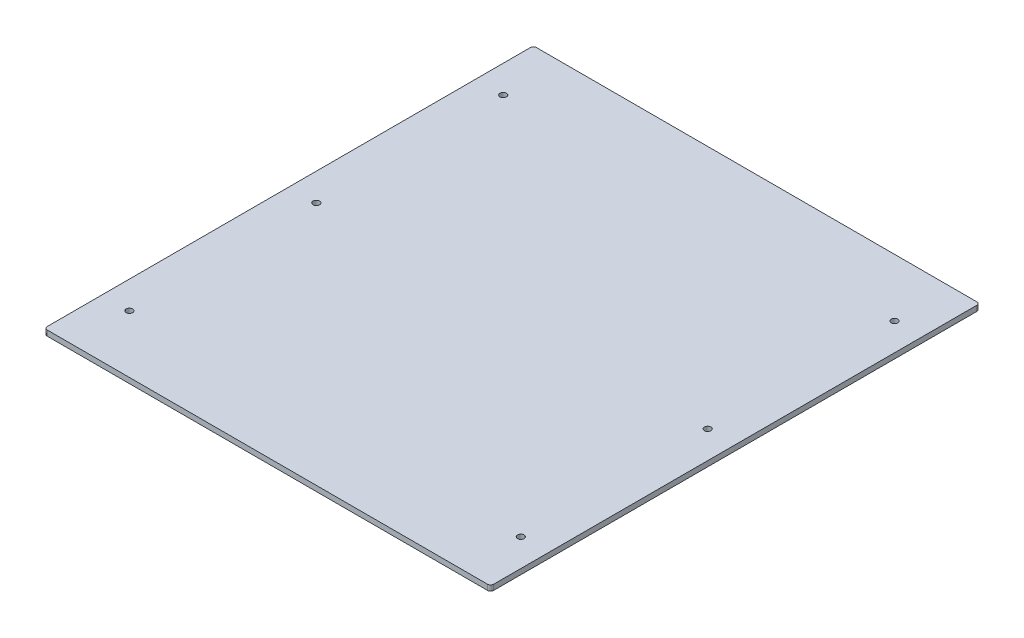
ISO-10303-21;
HEADER;
FILE_DESCRIPTION(('STEP AP214'),'2;1');
FILE_NAME('part.step','',(''),(''),'','','');
FILE_SCHEMA(('AUTOMOTIVE_DESIGN { 1 0 10303 214 1 1 1 1 }'));
ENDSEC;
DATA;
#1=APPLICATION_CONTEXT('core data for automotive mechanical design processes');
#2=APPLICATION_PROTOCOL_DEFINITION('international standard','automotive_design',2000,#1);
#3=PRODUCT_CONTEXT('',#1,'mechanical');
#4=PRODUCT('Part','Part','',(#3));
#5=PRODUCT_RELATED_PRODUCT_CATEGORY('part','',(#4));
#6=PRODUCT_DEFINITION_FORMATION('','',#4);
#7=PRODUCT_DEFINITION_CONTEXT('part definition',#1,'design');
#8=PRODUCT_DEFINITION('design','',#6,#7);
#9=PRODUCT_DEFINITION_SHAPE('','',#8);
#10=(LENGTH_UNIT() NAMED_UNIT(*) SI_UNIT(.MILLI.,.METRE.));
#11=(NAMED_UNIT(*) PLANE_ANGLE_UNIT() SI_UNIT($,.RADIAN.));
#12=(NAMED_UNIT(*) SI_UNIT($,.STERADIAN.) SOLID_ANGLE_UNIT());
#13=UNCERTAINTY_MEASURE_WITH_UNIT(LENGTH_MEASURE(1.E-05),#10,'distance_accuracy_value','');
#14=(GEOMETRIC_REPRESENTATION_CONTEXT(3) GLOBAL_UNCERTAINTY_ASSIGNED_CONTEXT((#13)) GLOBAL_UNIT_ASSIGNED_CONTEXT((#10,
#11,#12)) REPRESENTATION_CONTEXT('',''));
#15=CARTESIAN_POINT('',(0.,0.,0.));
#16=DIRECTION('',(0.,0.,1.));
#17=DIRECTION('',(1.,0.,0.));
#18=AXIS2_PLACEMENT_3D('',#15,#16,#17);
#19=CARTESIAN_POINT('',(0.,5.588,0.));
#20=DIRECTION('',(0.,-1.,0.));
#21=DIRECTION('',(0.,0.,-1.));
#22=AXIS2_PLACEMENT_3D('',#19,#20,#21);
#23=PLANE('',#22);
#24=DIRECTION('',(-1.,0.,0.));
#25=VECTOR('',#24,1.);
#26=CARTESIAN_POINT('',(0.,5.588,-508.));
#27=LINE('',#26,#25);
#28=CARTESIAN_POINT('',(460.375,5.588,-508.));
#29=VERTEX_POINT('',#28);
#30=CARTESIAN_POINT('',(3.175,5.588,-508.));
#31=VERTEX_POINT('',#30);
#32=EDGE_CURVE('E148',#29,#31,#27,.T.);
#33=ORIENTED_EDGE('',*,*,#32,.T.);
#34=CARTESIAN_POINT('',(3.175,5.588,-504.825));
#35=DIRECTION('',(0.,-1.,0.));
#36=DIRECTION('',(0.,0.,-1.));
#37=AXIS2_PLACEMENT_3D('',#34,#35,#36);
#38=CIRCLE('',#37,3.175);
#39=CARTESIAN_POINT('',(0.,5.588,-504.825));
#40=VERTEX_POINT('',#39);
#41=EDGE_CURVE('E177',#31,#40,#38,.F.);
#42=ORIENTED_EDGE('',*,*,#41,.T.);
#43=DIRECTION('',(0.,0.,1.));
#44=VECTOR('',#43,1.);
#45=CARTESIAN_POINT('',(0.,5.588,0.));
#46=LINE('',#45,#44);
#47=CARTESIAN_POINT('',(0.,5.588,-3.175));
#48=VERTEX_POINT('',#47);
#49=EDGE_CURVE('E125',#40,#48,#46,.T.);
#50=ORIENTED_EDGE('',*,*,#49,.T.);
#51=CARTESIAN_POINT('',(3.175,5.588,-3.175));
#52=DIRECTION('',(0.,-1.,0.));
#53=DIRECTION('',(0.,0.,-1.));
#54=AXIS2_PLACEMENT_3D('',#51,#52,#53);
#55=CIRCLE('',#54,3.175);
#56=CARTESIAN_POINT('',(3.175,5.588,0.));
#57=VERTEX_POINT('',#56);
#58=EDGE_CURVE('E171',#48,#57,#55,.F.);
#59=ORIENTED_EDGE('',*,*,#58,.T.);
#60=DIRECTION('',(1.,0.,0.));
#61=VECTOR('',#60,1.);
#62=CARTESIAN_POINT('',(0.,5.588,0.));
#63=LINE('',#62,#61);
#64=CARTESIAN_POINT('',(460.375,5.588,0.));
#65=VERTEX_POINT('',#64);
#66=EDGE_CURVE('E191',#57,#65,#63,.T.);
#67=ORIENTED_EDGE('',*,*,#66,.T.);
#68=CARTESIAN_POINT('',(460.375,5.588,-3.175));
#69=DIRECTION('',(0.,-1.,0.));
#70=DIRECTION('',(0.,0.,-1.));
#71=AXIS2_PLACEMENT_3D('',#68,#69,#70);
#72=CIRCLE('',#71,3.175);
#73=CARTESIAN_POINT('',(463.55,5.588,-3.175));
#74=VERTEX_POINT('',#73);
#75=EDGE_CURVE('E59',#65,#74,#72,.F.);
#76=ORIENTED_EDGE('',*,*,#75,.T.);
#77=DIRECTION('',(0.,0.,-1.));
#78=VECTOR('',#77,1.);
#79=CARTESIAN_POINT('',(463.55,5.588,0.));
#80=LINE('',#79,#78);
#81=CARTESIAN_POINT('',(463.55,5.588,-504.825));
#82=VERTEX_POINT('',#81);
#83=EDGE_CURVE('E198',#74,#82,#80,.T.);
#84=ORIENTED_EDGE('',*,*,#83,.T.);
#85=CARTESIAN_POINT('',(460.375,5.588,-504.825));
#86=DIRECTION('',(0.,-1.,0.));
#87=DIRECTION('',(0.,0.,-1.));
#88=AXIS2_PLACEMENT_3D('',#85,#86,#87);
#89=CIRCLE('',#88,3.175);
#90=EDGE_CURVE('E174',#82,#29,#89,.F.);
#91=ORIENTED_EDGE('',*,*,#90,.T.);
#92=EDGE_LOOP('',(#33,#42,#50,#59,#67,#76,#84,#91));
#93=FACE_BOUND('',#92,.T.);
#94=CARTESIAN_POINT('',(28.575,5.588,-59.944));
#95=DIRECTION('',(0.,1.,0.));
#96=DIRECTION('',(0.,0.,1.));
#97=AXIS2_PLACEMENT_3D('',#94,#95,#96);
#98=CIRCLE('',#97,3.37820000000002);
#99=CARTESIAN_POINT('',(28.575,5.588,-56.5658));
#100=VERTEX_POINT('',#99);
#101=EDGE_CURVE('E136',#100,#100,#98,.T.);
#102=ORIENTED_EDGE('',*,*,#101,.F.);
#103=EDGE_LOOP('',(#102));
#104=FACE_BOUND('',#103,.T.);
#105=CARTESIAN_POINT('',(28.575,5.588,-254.));
#106=DIRECTION('',(0.,1.,0.));
#107=DIRECTION('',(0.,0.,1.));
#108=AXIS2_PLACEMENT_3D('',#105,#106,#107);
#109=CIRCLE('',#108,3.37819999999999);
#110=CARTESIAN_POINT('',(28.575,5.588,-250.6218));
#111=VERTEX_POINT('',#110);
#112=EDGE_CURVE('E219',#111,#111,#109,.T.);
#113=ORIENTED_EDGE('',*,*,#112,.F.);
#114=EDGE_LOOP('',(#113));
#115=FACE_BOUND('',#114,.T.);
#116=CARTESIAN_POINT('',(28.575,5.588,-448.056));
#117=DIRECTION('',(0.,1.,0.));
#118=DIRECTION('',(0.,0.,1.));
#119=AXIS2_PLACEMENT_3D('',#116,#117,#118);
#120=CIRCLE('',#119,3.37819999999999);
#121=CARTESIAN_POINT('',(28.575,5.588,-444.6778));
#122=VERTEX_POINT('',#121);
#123=EDGE_CURVE('E225',#122,#122,#120,.T.);
#124=ORIENTED_EDGE('',*,*,#123,.F.);
#125=EDGE_LOOP('',(#124));
#126=FACE_BOUND('',#125,.T.);
#127=CARTESIAN_POINT('',(434.975,5.588,-448.056));
#128=DIRECTION('',(0.,1.,0.));
#129=DIRECTION('',(0.,0.,-1.));
#130=AXIS2_PLACEMENT_3D('',#127,#128,#129);
#131=CIRCLE('',#130,3.37819999999999);
#132=CARTESIAN_POINT('',(434.975,5.588,-451.4342));
#133=VERTEX_POINT('',#132);
#134=EDGE_CURVE('E233',#133,#133,#131,.T.);
#135=ORIENTED_EDGE('',*,*,#134,.F.);
#136=EDGE_LOOP('',(#135));
#137=FACE_BOUND('',#136,.T.);
#138=CARTESIAN_POINT('',(434.975,5.588,-254.));
#139=DIRECTION('',(0.,1.,0.));
#140=DIRECTION('',(0.,0.,-1.));
#141=AXIS2_PLACEMENT_3D('',#138,#139,#140);
#142=CIRCLE('',#141,3.37819999999999);
#143=CARTESIAN_POINT('',(434.975,5.588,-257.3782));
#144=VERTEX_POINT('',#143);
#145=EDGE_CURVE('E241',#144,#144,#142,.T.);
#146=ORIENTED_EDGE('',*,*,#145,.F.);
#147=EDGE_LOOP('',(#146));
#148=FACE_BOUND('',#147,.T.);
#149=CARTESIAN_POINT('',(434.975,5.588,-59.944));
#150=DIRECTION('',(0.,1.,0.));
#151=DIRECTION('',(0.,0.,-1.));
#152=AXIS2_PLACEMENT_3D('',#149,#150,#151);
#153=CIRCLE('',#152,3.37819999999999);
#154=CARTESIAN_POINT('',(434.975,5.588,-63.3222));
#155=VERTEX_POINT('',#154);
#156=EDGE_CURVE('E249',#155,#155,#153,.T.);
#157=ORIENTED_EDGE('',*,*,#156,.F.);
#158=EDGE_LOOP('',(#157));
#159=FACE_BOUND('',#158,.T.);
#160=ADVANCED_FACE('F36',(#93,#104,#115,#126,#137,#148,#159),#23,.F.);
#161=CARTESIAN_POINT('',(0.,0.,0.));
#162=DIRECTION('',(0.,-1.,0.));
#163=DIRECTION('',(0.,0.,-1.));
#164=AXIS2_PLACEMENT_3D('',#161,#162,#163);
#165=PLANE('',#164);
#166=CARTESIAN_POINT('',(434.975,0.,-254.));
#167=DIRECTION('',(0.,1.,0.));
#168=DIRECTION('',(0.,0.,-1.));
#169=AXIS2_PLACEMENT_3D('',#166,#167,#168);
#170=CIRCLE('',#169,3.37819999999999);
#171=CARTESIAN_POINT('',(434.975,0.,-257.3782));
#172=VERTEX_POINT('',#171);
#173=EDGE_CURVE('E245',#172,#172,#170,.T.);
#174=ORIENTED_EDGE('',*,*,#173,.T.);
#175=EDGE_LOOP('',(#174));
#176=FACE_BOUND('',#175,.T.);
#177=CARTESIAN_POINT('',(28.575,0.,-448.056));
#178=DIRECTION('',(0.,1.,0.));
#179=DIRECTION('',(0.,0.,1.));
#180=AXIS2_PLACEMENT_3D('',#177,#178,#179);
#181=CIRCLE('',#180,3.37819999999999);
#182=CARTESIAN_POINT('',(28.575,0.,-444.6778));
#183=VERTEX_POINT('',#182);
#184=EDGE_CURVE('E229',#183,#183,#181,.T.);
#185=ORIENTED_EDGE('',*,*,#184,.T.);
#186=EDGE_LOOP('',(#185));
#187=FACE_BOUND('',#186,.T.);
#188=CARTESIAN_POINT('',(28.575,0.,-59.944));
#189=DIRECTION('',(0.,1.,0.));
#190=DIRECTION('',(0.,0.,1.));
#191=AXIS2_PLACEMENT_3D('',#188,#189,#190);
#192=CIRCLE('',#191,3.37820000000002);
#193=CARTESIAN_POINT('',(28.575,0.,-56.5658));
#194=VERTEX_POINT('',#193);
#195=EDGE_CURVE('E145',#194,#194,#192,.T.);
#196=ORIENTED_EDGE('',*,*,#195,.T.);
#197=EDGE_LOOP('',(#196));
#198=FACE_BOUND('',#197,.T.);
#199=DIRECTION('',(0.,0.,1.));
#200=VECTOR('',#199,1.);
#201=CARTESIAN_POINT('',(0.,0.,0.));
#202=LINE('',#201,#200);
#203=CARTESIAN_POINT('',(0.,0.,-504.825));
#204=VERTEX_POINT('',#203);
#205=CARTESIAN_POINT('',(0.,0.,-3.175));
#206=VERTEX_POINT('',#205);
#207=EDGE_CURVE('E122',#204,#206,#202,.T.);
#208=ORIENTED_EDGE('',*,*,#207,.F.);
#209=CARTESIAN_POINT('',(3.175,0.,-504.825));
#210=DIRECTION('',(0.,-1.,0.));
#211=DIRECTION('',(0.,0.,-1.));
#212=AXIS2_PLACEMENT_3D('',#209,#210,#211);
#213=CIRCLE('',#212,3.175);
#214=CARTESIAN_POINT('',(3.175,0.,-508.));
#215=VERTEX_POINT('',#214);
#216=EDGE_CURVE('E104',#204,#215,#213,.T.);
#217=ORIENTED_EDGE('',*,*,#216,.T.);
#218=DIRECTION('',(-1.,0.,0.));
#219=VECTOR('',#218,1.);
#220=CARTESIAN_POINT('',(0.,0.,-508.));
#221=LINE('',#220,#219);
#222=CARTESIAN_POINT('',(460.375,0.,-508.));
#223=VERTEX_POINT('',#222);
#224=EDGE_CURVE('E153',#223,#215,#221,.T.);
#225=ORIENTED_EDGE('',*,*,#224,.F.);
#226=CARTESIAN_POINT('',(460.375,0.,-504.825));
#227=DIRECTION('',(0.,-1.,0.));
#228=DIRECTION('',(0.,0.,-1.));
#229=AXIS2_PLACEMENT_3D('',#226,#227,#228);
#230=CIRCLE('',#229,3.175);
#231=CARTESIAN_POINT('',(463.55,0.,-504.825));
#232=VERTEX_POINT('',#231);
#233=EDGE_CURVE('E116',#223,#232,#230,.T.);
#234=ORIENTED_EDGE('',*,*,#233,.T.);
#235=DIRECTION('',(0.,0.,-1.));
#236=VECTOR('',#235,1.);
#237=CARTESIAN_POINT('',(463.55,0.,0.));
#238=LINE('',#237,#236);
#239=CARTESIAN_POINT('',(463.55,0.,-3.175));
#240=VERTEX_POINT('',#239);
#241=EDGE_CURVE('E142',#240,#232,#238,.T.);
#242=ORIENTED_EDGE('',*,*,#241,.F.);
#243=CARTESIAN_POINT('',(460.375,0.,-3.175));
#244=DIRECTION('',(0.,-1.,0.));
#245=DIRECTION('',(0.,0.,-1.));
#246=AXIS2_PLACEMENT_3D('',#243,#244,#245);
#247=CIRCLE('',#246,3.175);
#248=CARTESIAN_POINT('',(460.375,0.,0.));
#249=VERTEX_POINT('',#248);
#250=EDGE_CURVE('E127',#240,#249,#247,.T.);
#251=ORIENTED_EDGE('',*,*,#250,.T.);
#252=DIRECTION('',(1.,0.,0.));
#253=VECTOR('',#252,1.);
#254=CARTESIAN_POINT('',(0.,0.,0.));
#255=LINE('',#254,#253);
#256=CARTESIAN_POINT('',(3.175,0.,0.));
#257=VERTEX_POINT('',#256);
#258=EDGE_CURVE('E135',#257,#249,#255,.T.);
#259=ORIENTED_EDGE('',*,*,#258,.F.);
#260=CARTESIAN_POINT('',(3.175,0.,-3.175));
#261=DIRECTION('',(0.,-1.,0.));
#262=DIRECTION('',(0.,0.,-1.));
#263=AXIS2_PLACEMENT_3D('',#260,#261,#262);
#264=CIRCLE('',#263,3.175);
#265=EDGE_CURVE('E133',#257,#206,#264,.T.);
#266=ORIENTED_EDGE('',*,*,#265,.T.);
#267=EDGE_LOOP('',(#208,#217,#225,#234,#242,#251,#259,#266));
#268=FACE_BOUND('',#267,.T.);
#269=CARTESIAN_POINT('',(28.575,0.,-254.));
#270=DIRECTION('',(0.,1.,0.));
#271=DIRECTION('',(0.,0.,1.));
#272=AXIS2_PLACEMENT_3D('',#269,#270,#271);
#273=CIRCLE('',#272,3.37819999999999);
#274=CARTESIAN_POINT('',(28.575,0.,-250.6218));
#275=VERTEX_POINT('',#274);
#276=EDGE_CURVE('E221',#275,#275,#273,.T.);
#277=ORIENTED_EDGE('',*,*,#276,.T.);
#278=EDGE_LOOP('',(#277));
#279=FACE_BOUND('',#278,.T.);
#280=CARTESIAN_POINT('',(434.975,0.,-448.056));
#281=DIRECTION('',(0.,1.,0.));
#282=DIRECTION('',(0.,0.,-1.));
#283=AXIS2_PLACEMENT_3D('',#280,#281,#282);
#284=CIRCLE('',#283,3.37819999999999);
#285=CARTESIAN_POINT('',(434.975,0.,-451.4342));
#286=VERTEX_POINT('',#285);
#287=EDGE_CURVE('E237',#286,#286,#284,.T.);
#288=ORIENTED_EDGE('',*,*,#287,.T.);
#289=EDGE_LOOP('',(#288));
#290=FACE_BOUND('',#289,.T.);
#291=CARTESIAN_POINT('',(434.975,0.,-59.944));
#292=DIRECTION('',(0.,1.,0.));
#293=DIRECTION('',(0.,0.,-1.));
#294=AXIS2_PLACEMENT_3D('',#291,#292,#293);
#295=CIRCLE('',#294,3.37819999999999);
#296=CARTESIAN_POINT('',(434.975,0.,-63.3222));
#297=VERTEX_POINT('',#296);
#298=EDGE_CURVE('E253',#297,#297,#295,.T.);
#299=ORIENTED_EDGE('',*,*,#298,.T.);
#300=EDGE_LOOP('',(#299));
#301=FACE_BOUND('',#300,.T.);
#302=ADVANCED_FACE('F130',(#176,#187,#198,#268,#279,#290,#301),#165,.T.);
#303=CARTESIAN_POINT('',(0.,5.588,0.));
#304=DIRECTION('',(1.,0.,0.));
#305=DIRECTION('',(0.,0.,-1.));
#306=AXIS2_PLACEMENT_3D('',#303,#304,#305);
#307=PLANE('',#306);
#308=ORIENTED_EDGE('',*,*,#49,.F.);
#309=DIRECTION('',(0.,-1.,0.));
#310=VECTOR('',#309,1.);
#311=CARTESIAN_POINT('',(0.,5.588,-504.825));
#312=LINE('',#311,#310);
#313=EDGE_CURVE('E108',#40,#204,#312,.T.);
#314=ORIENTED_EDGE('',*,*,#313,.T.);
#315=ORIENTED_EDGE('',*,*,#207,.T.);
#316=DIRECTION('',(0.,-1.,0.));
#317=VECTOR('',#316,1.);
#318=CARTESIAN_POINT('',(0.,5.588,-3.175));
#319=LINE('',#318,#317);
#320=EDGE_CURVE('E128',#206,#48,#319,.F.);
#321=ORIENTED_EDGE('',*,*,#320,.T.);
#322=EDGE_LOOP('',(#308,#314,#315,#321));
#323=FACE_BOUND('',#322,.T.);
#324=ADVANCED_FACE('F121',(#323),#307,.F.);
#325=CARTESIAN_POINT('',(0.,5.588,0.));
#326=DIRECTION('',(0.,0.,-1.));
#327=DIRECTION('',(-1.,0.,0.));
#328=AXIS2_PLACEMENT_3D('',#325,#326,#327);
#329=PLANE('',#328);
#330=ORIENTED_EDGE('',*,*,#66,.F.);
#331=DIRECTION('',(0.,-1.,0.));
#332=VECTOR('',#331,1.);
#333=CARTESIAN_POINT('',(3.175,5.588,0.));
#334=LINE('',#333,#332);
#335=EDGE_CURVE('E11',#57,#257,#334,.T.);
#336=ORIENTED_EDGE('',*,*,#335,.T.);
#337=ORIENTED_EDGE('',*,*,#258,.T.);
#338=DIRECTION('',(0.,-1.,0.));
#339=VECTOR('',#338,1.);
#340=CARTESIAN_POINT('',(460.375,5.588,0.));
#341=LINE('',#340,#339);
#342=EDGE_CURVE('E45',#249,#65,#341,.F.);
#343=ORIENTED_EDGE('',*,*,#342,.T.);
#344=EDGE_LOOP('',(#330,#336,#337,#343));
#345=FACE_BOUND('',#344,.T.);
#346=ADVANCED_FACE('F190',(#345),#329,.F.);
#347=CARTESIAN_POINT('',(463.55,5.588,0.));
#348=DIRECTION('',(-1.,0.,0.));
#349=DIRECTION('',(0.,0.,1.));
#350=AXIS2_PLACEMENT_3D('',#347,#348,#349);
#351=PLANE('',#350);
#352=ORIENTED_EDGE('',*,*,#241,.T.);
#353=DIRECTION('',(0.,-1.,0.));
#354=VECTOR('',#353,1.);
#355=CARTESIAN_POINT('',(463.55,5.588,-504.825));
#356=LINE('',#355,#354);
#357=EDGE_CURVE('E52',#232,#82,#356,.F.);
#358=ORIENTED_EDGE('',*,*,#357,.T.);
#359=ORIENTED_EDGE('',*,*,#83,.F.);
#360=DIRECTION('',(0.,-1.,0.));
#361=VECTOR('',#360,1.);
#362=CARTESIAN_POINT('',(463.55,5.588,-3.175));
#363=LINE('',#362,#361);
#364=EDGE_CURVE('E180',#74,#240,#363,.T.);
#365=ORIENTED_EDGE('',*,*,#364,.T.);
#366=EDGE_LOOP('',(#352,#358,#359,#365));
#367=FACE_BOUND('',#366,.T.);
#368=ADVANCED_FACE('F202',(#367),#351,.F.);
#369=CARTESIAN_POINT('',(0.,5.588,-508.));
#370=DIRECTION('',(0.,0.,1.));
#371=DIRECTION('',(1.,0.,0.));
#372=AXIS2_PLACEMENT_3D('',#369,#370,#371);
#373=PLANE('',#372);
#374=ORIENTED_EDGE('',*,*,#224,.T.);
#375=DIRECTION('',(0.,-1.,0.));
#376=VECTOR('',#375,1.);
#377=CARTESIAN_POINT('',(3.175,5.588,-508.));
#378=LINE('',#377,#376);
#379=EDGE_CURVE('E109',#215,#31,#378,.F.);
#380=ORIENTED_EDGE('',*,*,#379,.T.);
#381=ORIENTED_EDGE('',*,*,#32,.F.);
#382=DIRECTION('',(0.,-1.,0.));
#383=VECTOR('',#382,1.);
#384=CARTESIAN_POINT('',(460.375,5.588,-508.));
#385=LINE('',#384,#383);
#386=EDGE_CURVE('E115',#29,#223,#385,.T.);
#387=ORIENTED_EDGE('',*,*,#386,.T.);
#388=EDGE_LOOP('',(#374,#380,#381,#387));
#389=FACE_BOUND('',#388,.T.);
#390=ADVANCED_FACE('F209',(#389),#373,.F.);
#391=CARTESIAN_POINT('',(28.575,5.588,-59.944));
#392=DIRECTION('',(0.,-1.,0.));
#393=DIRECTION('',(0.,0.,-1.));
#394=AXIS2_PLACEMENT_3D('',#391,#392,#393);
#395=CYLINDRICAL_SURFACE('',#394,3.37820000000002);
#396=ORIENTED_EDGE('',*,*,#101,.T.);
#397=EDGE_LOOP('',(#396));
#398=FACE_BOUND('',#397,.T.);
#399=ORIENTED_EDGE('',*,*,#195,.F.);
#400=EDGE_LOOP('',(#399));
#401=FACE_BOUND('',#400,.T.);
#402=ADVANCED_FACE('F273',(#398,#401),#395,.F.);
#403=CARTESIAN_POINT('',(28.575,5.588,-254.));
#404=DIRECTION('',(0.,-1.,0.));
#405=DIRECTION('',(0.,0.,-1.));
#406=AXIS2_PLACEMENT_3D('',#403,#404,#405);
#407=CYLINDRICAL_SURFACE('',#406,3.37819999999999);
#408=ORIENTED_EDGE('',*,*,#112,.T.);
#409=EDGE_LOOP('',(#408));
#410=FACE_BOUND('',#409,.T.);
#411=ORIENTED_EDGE('',*,*,#276,.F.);
#412=EDGE_LOOP('',(#411));
#413=FACE_BOUND('',#412,.T.);
#414=ADVANCED_FACE('F351',(#410,#413),#407,.F.);
#415=CARTESIAN_POINT('',(28.575,5.588,-448.056));
#416=DIRECTION('',(0.,-1.,0.));
#417=DIRECTION('',(0.,0.,-1.));
#418=AXIS2_PLACEMENT_3D('',#415,#416,#417);
#419=CYLINDRICAL_SURFACE('',#418,3.37819999999999);
#420=ORIENTED_EDGE('',*,*,#123,.T.);
#421=EDGE_LOOP('',(#420));
#422=FACE_BOUND('',#421,.T.);
#423=ORIENTED_EDGE('',*,*,#184,.F.);
#424=EDGE_LOOP('',(#423));
#425=FACE_BOUND('',#424,.T.);
#426=ADVANCED_FACE('F341',(#422,#425),#419,.F.);
#427=CARTESIAN_POINT('',(434.975,5.588,-448.056));
#428=DIRECTION('',(0.,-1.,0.));
#429=DIRECTION('',(0.,0.,-1.));
#430=AXIS2_PLACEMENT_3D('',#427,#428,#429);
#431=CYLINDRICAL_SURFACE('',#430,3.37819999999999);
#432=ORIENTED_EDGE('',*,*,#134,.T.);
#433=EDGE_LOOP('',(#432));
#434=FACE_BOUND('',#433,.T.);
#435=ORIENTED_EDGE('',*,*,#287,.F.);
#436=EDGE_LOOP('',(#435));
#437=FACE_BOUND('',#436,.T.);
#438=ADVANCED_FACE('F331',(#434,#437),#431,.F.);
#439=CARTESIAN_POINT('',(434.975,5.588,-254.));
#440=DIRECTION('',(0.,-1.,0.));
#441=DIRECTION('',(0.,0.,-1.));
#442=AXIS2_PLACEMENT_3D('',#439,#440,#441);
#443=CYLINDRICAL_SURFACE('',#442,3.37819999999999);
#444=ORIENTED_EDGE('',*,*,#145,.T.);
#445=EDGE_LOOP('',(#444));
#446=FACE_BOUND('',#445,.T.);
#447=ORIENTED_EDGE('',*,*,#173,.F.);
#448=EDGE_LOOP('',(#447));
#449=FACE_BOUND('',#448,.T.);
#450=ADVANCED_FACE('F321',(#446,#449),#443,.F.);
#451=CARTESIAN_POINT('',(434.975,5.588,-59.944));
#452=DIRECTION('',(0.,-1.,0.));
#453=DIRECTION('',(0.,0.,-1.));
#454=AXIS2_PLACEMENT_3D('',#451,#452,#453);
#455=CYLINDRICAL_SURFACE('',#454,3.37819999999999);
#456=ORIENTED_EDGE('',*,*,#156,.T.);
#457=EDGE_LOOP('',(#456));
#458=FACE_BOUND('',#457,.T.);
#459=ORIENTED_EDGE('',*,*,#298,.F.);
#460=EDGE_LOOP('',(#459));
#461=FACE_BOUND('',#460,.T.);
#462=ADVANCED_FACE('F262',(#458,#461),#455,.F.);
#463=CARTESIAN_POINT('',(3.175,5.588,-504.825));
#464=DIRECTION('',(0.,-1.,0.));
#465=DIRECTION('',(0.,0.,-1.));
#466=AXIS2_PLACEMENT_3D('',#463,#464,#465);
#467=CYLINDRICAL_SURFACE('',#466,3.175);
#468=ORIENTED_EDGE('',*,*,#41,.F.);
#469=ORIENTED_EDGE('',*,*,#379,.F.);
#470=ORIENTED_EDGE('',*,*,#216,.F.);
#471=ORIENTED_EDGE('',*,*,#313,.F.);
#472=EDGE_LOOP('',(#468,#469,#470,#471));
#473=FACE_BOUND('',#472,.T.);
#474=ADVANCED_FACE('F107',(#473),#467,.T.);
#475=CARTESIAN_POINT('',(460.375,5.588,-504.825));
#476=DIRECTION('',(0.,-1.,0.));
#477=DIRECTION('',(0.,0.,-1.));
#478=AXIS2_PLACEMENT_3D('',#475,#476,#477);
#479=CYLINDRICAL_SURFACE('',#478,3.175);
#480=ORIENTED_EDGE('',*,*,#90,.F.);
#481=ORIENTED_EDGE('',*,*,#357,.F.);
#482=ORIENTED_EDGE('',*,*,#233,.F.);
#483=ORIENTED_EDGE('',*,*,#386,.F.);
#484=EDGE_LOOP('',(#480,#481,#482,#483));
#485=FACE_BOUND('',#484,.T.);
#486=ADVANCED_FACE('F206',(#485),#479,.T.);
#487=CARTESIAN_POINT('',(3.175,5.588,-3.175));
#488=DIRECTION('',(0.,-1.,0.));
#489=DIRECTION('',(0.,0.,-1.));
#490=AXIS2_PLACEMENT_3D('',#487,#488,#489);
#491=CYLINDRICAL_SURFACE('',#490,3.175);
#492=ORIENTED_EDGE('',*,*,#58,.F.);
#493=ORIENTED_EDGE('',*,*,#320,.F.);
#494=ORIENTED_EDGE('',*,*,#265,.F.);
#495=ORIENTED_EDGE('',*,*,#335,.F.);
#496=EDGE_LOOP('',(#492,#493,#494,#495));
#497=FACE_BOUND('',#496,.T.);
#498=ADVANCED_FACE('F287',(#497),#491,.T.);
#499=CARTESIAN_POINT('',(460.375,5.588,-3.175));
#500=DIRECTION('',(0.,-1.,0.));
#501=DIRECTION('',(0.,0.,-1.));
#502=AXIS2_PLACEMENT_3D('',#499,#500,#501);
#503=CYLINDRICAL_SURFACE('',#502,3.175);
#504=ORIENTED_EDGE('',*,*,#75,.F.);
#505=ORIENTED_EDGE('',*,*,#342,.F.);
#506=ORIENTED_EDGE('',*,*,#250,.F.);
#507=ORIENTED_EDGE('',*,*,#364,.F.);
#508=EDGE_LOOP('',(#504,#505,#506,#507));
#509=FACE_BOUND('',#508,.T.);
#510=ADVANCED_FACE('F38',(#509),#503,.T.);
#511=CLOSED_SHELL('',(#160,#302,#324,#346,#368,#390,#402,#414,#426,#438,#450,#462,#474,#486,
#498,#510));
#512=MANIFOLD_SOLID_BREP('B2',#511);
#513=ADVANCED_BREP_SHAPE_REPRESENTATION('',(#18,#512),#14);
#514=SHAPE_DEFINITION_REPRESENTATION(#9,#513);
ENDSEC;
END-ISO-10303-21;
